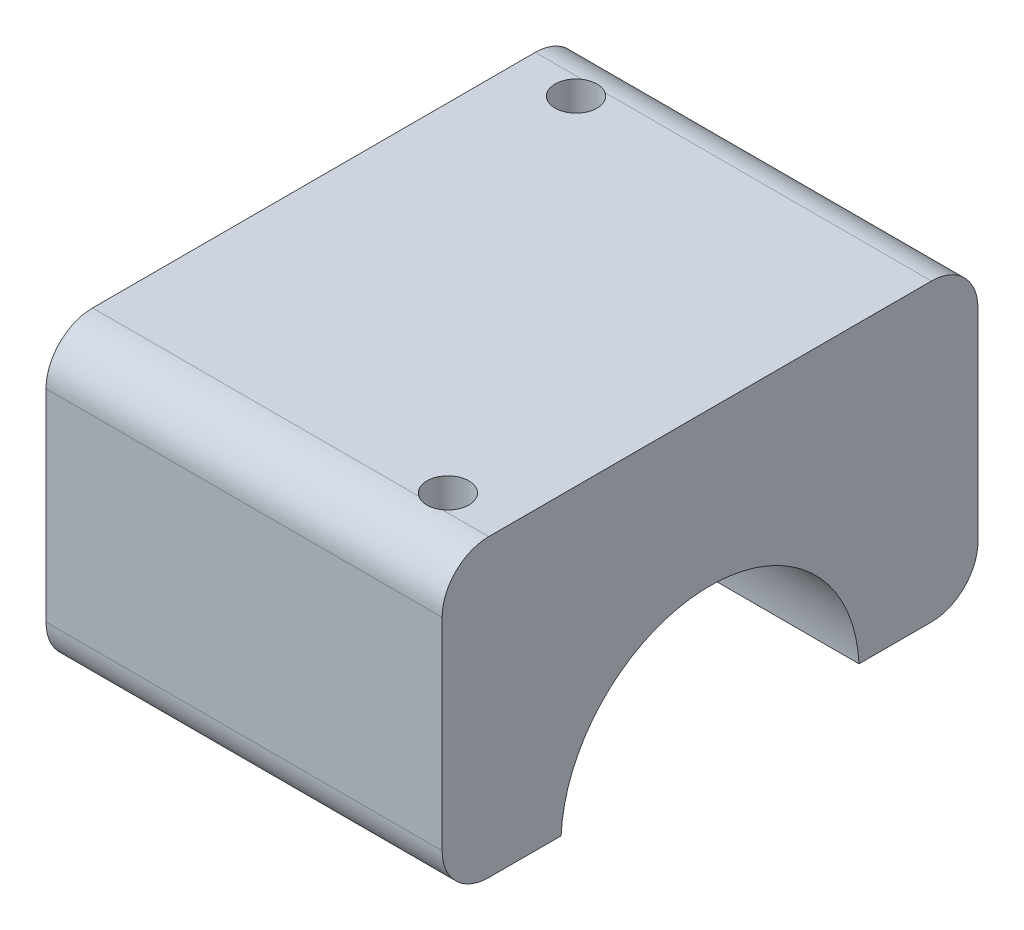
ISO-10303-21;
HEADER;
FILE_DESCRIPTION(('STEP AP214'),'2;1');
FILE_NAME('part.step','',(''),(''),'','','');
FILE_SCHEMA(('AUTOMOTIVE_DESIGN { 1 0 10303 214 1 1 1 1 }'));
ENDSEC;
DATA;
#1=APPLICATION_CONTEXT('core data for automotive mechanical design processes');
#2=APPLICATION_PROTOCOL_DEFINITION('international standard','automotive_design',2000,#1);
#3=PRODUCT_CONTEXT('',#1,'mechanical');
#4=PRODUCT('Part','Part','',(#3));
#5=PRODUCT_RELATED_PRODUCT_CATEGORY('part','',(#4));
#6=PRODUCT_DEFINITION_FORMATION('','',#4);
#7=PRODUCT_DEFINITION_CONTEXT('part definition',#1,'design');
#8=PRODUCT_DEFINITION('design','',#6,#7);
#9=PRODUCT_DEFINITION_SHAPE('','',#8);
#10=(LENGTH_UNIT() NAMED_UNIT(*) SI_UNIT(.MILLI.,.METRE.));
#11=(NAMED_UNIT(*) PLANE_ANGLE_UNIT() SI_UNIT($,.RADIAN.));
#12=(NAMED_UNIT(*) SI_UNIT($,.STERADIAN.) SOLID_ANGLE_UNIT());
#13=UNCERTAINTY_MEASURE_WITH_UNIT(LENGTH_MEASURE(1.E-05),#10,'distance_accuracy_value','');
#14=(GEOMETRIC_REPRESENTATION_CONTEXT(3) GLOBAL_UNCERTAINTY_ASSIGNED_CONTEXT((#13)) GLOBAL_UNIT_ASSIGNED_CONTEXT((#10,
#11,#12)) REPRESENTATION_CONTEXT('',''));
#15=CARTESIAN_POINT('',(0.,0.,0.));
#16=DIRECTION('',(0.,0.,1.));
#17=DIRECTION('',(1.,0.,0.));
#18=AXIS2_PLACEMENT_3D('',#15,#16,#17);
#19=CARTESIAN_POINT('',(17.,4.6,19.));
#20=DIRECTION('',(-1.,0.,0.));
#21=DIRECTION('',(0.,0.,1.));
#22=AXIS2_PLACEMENT_3D('',#19,#20,#21);
#23=CYLINDRICAL_SURFACE('',#22,4.);
#24=CARTESIAN_POINT('',(12.9949874371066,0.6,19.));
#25=CARTESIAN_POINT('',(12.9528080505859,0.600002290201008,19.0279782687762));
#26=CARTESIAN_POINT('',(12.9094699375662,0.600293109258532,19.054162436945));
#27=CARTESIAN_POINT('',(12.8207506643026,0.601246630542694,19.1027880961604));
#28=CARTESIAN_POINT('',(12.775369663094,0.601909303866988,19.1252298779078));
#29=CARTESIAN_POINT('',(12.6367080465194,0.60414515604213,19.1866521635867));
#30=CARTESIAN_POINT('',(12.5407755741953,0.605967454515857,19.2198177956695));
#31=CARTESIAN_POINT('',(12.3447108790185,0.609016111648687,19.2695824039112));
#32=CARTESIAN_POINT('',(12.2445771529861,0.610242254997947,19.2861753969049));
#33=CARTESIAN_POINT('',(12.0429252939834,0.611432977587128,19.3023260095373));
#34=CARTESIAN_POINT('',(11.9414072407699,0.611397629202322,19.3018846064864));
#35=CARTESIAN_POINT('',(11.7400149572337,0.6100843959537,19.2839916011113));
#36=CARTESIAN_POINT('',(11.6401391343925,0.608807797075412,19.266557603754));
#37=CARTESIAN_POINT('',(11.444762981889,0.605710678825216,19.2151942389305));
#38=CARTESIAN_POINT('',(11.3492591599958,0.603890602630139,19.181278297527));
#39=CARTESIAN_POINT('',(11.2134628948282,0.601745422922836,19.1197807652606));
#40=CARTESIAN_POINT('',(11.1703945654969,0.601136078493984,19.0981480345368));
#41=CARTESIAN_POINT('',(11.0862091669758,0.600264553601652,19.0515455180329));
#42=CARTESIAN_POINT('',(11.0450884560688,0.600001698383489,19.0265823227808));
#43=CARTESIAN_POINT('',(11.0050125628934,0.6,19.));
#44=B_SPLINE_CURVE_WITH_KNOTS('',3,(#24,#25,#26,#27,#28,#29,#30,#31,#32,#33,#34,#35,#36,#37,#38,
#39,#40,#41,#42,#43),.UNSPECIFIED.,.F.,.F.,(4,2,2,2,2,2,2,2,2,4),(0.,0.151748564164442,
0.30348533531734,0.606485618853393,0.90959525408197,1.21268749909945,1.51546606256915,
1.81799839737315,1.96246492195647,2.10664969408635),.UNSPECIFIED.);
#45=CARTESIAN_POINT('',(12.9949874371066,0.6,19.));
#46=VERTEX_POINT('',#45);
#47=CARTESIAN_POINT('',(11.0050125628934,0.6,19.));
#48=VERTEX_POINT('',#47);
#49=EDGE_CURVE('E136',#46,#48,#44,.T.);
#50=ORIENTED_EDGE('',*,*,#49,.F.);
#51=DIRECTION('',(-1.,0.,0.));
#52=VECTOR('',#51,1.);
#53=CARTESIAN_POINT('',(17.,0.6,19.));
#54=LINE('',#53,#52);
#55=CARTESIAN_POINT('',(17.,0.6,19.));
#56=VERTEX_POINT('',#55);
#57=EDGE_CURVE('E150',#56,#46,#54,.T.);
#58=ORIENTED_EDGE('',*,*,#57,.F.);
#59=CARTESIAN_POINT('',(17.,4.6,19.));
#60=DIRECTION('',(1.,0.,0.));
#61=DIRECTION('',(0.,0.,-1.));
#62=AXIS2_PLACEMENT_3D('',#59,#60,#61);
#63=CIRCLE('',#62,4.);
#64=CARTESIAN_POINT('',(17.,4.6,23.));
#65=VERTEX_POINT('',#64);
#66=EDGE_CURVE('E333',#65,#56,#63,.T.);
#67=ORIENTED_EDGE('',*,*,#66,.F.);
#68=DIRECTION('',(-1.,0.,0.));
#69=VECTOR('',#68,1.);
#70=CARTESIAN_POINT('',(17.,4.6,23.));
#71=LINE('',#70,#69);
#72=CARTESIAN_POINT('',(-17.,4.6,23.));
#73=VERTEX_POINT('',#72);
#74=EDGE_CURVE('E313',#65,#73,#71,.T.);
#75=ORIENTED_EDGE('',*,*,#74,.T.);
#76=CARTESIAN_POINT('',(-17.,4.6,19.));
#77=DIRECTION('',(1.,0.,0.));
#78=DIRECTION('',(0.,0.,-1.));
#79=AXIS2_PLACEMENT_3D('',#76,#77,#78);
#80=CIRCLE('',#79,4.);
#81=CARTESIAN_POINT('',(-17.,0.6,19.));
#82=VERTEX_POINT('',#81);
#83=EDGE_CURVE('E155',#73,#82,#80,.T.);
#84=ORIENTED_EDGE('',*,*,#83,.T.);
#85=EDGE_CURVE('E148',#48,#82,#54,.T.);
#86=ORIENTED_EDGE('',*,*,#85,.F.);
#87=EDGE_LOOP('',(#50,#58,#67,#75,#84,#86));
#88=FACE_BOUND('',#87,.T.);
#89=ADVANCED_FACE('F39',(#88),#23,.T.);
#90=CARTESIAN_POINT('',(17.,4.6,-19.));
#91=DIRECTION('',(-1.,0.,0.));
#92=DIRECTION('',(0.,0.,1.));
#93=AXIS2_PLACEMENT_3D('',#90,#91,#92);
#94=CYLINDRICAL_SURFACE('',#93,4.);
#95=CARTESIAN_POINT('',(-12.9949874371066,0.6,-19.));
#96=CARTESIAN_POINT('',(-12.9528080505859,0.600002290201008,-19.0279782687762));
#97=CARTESIAN_POINT('',(-12.9094699375662,0.600293109258532,-19.054162436945));
#98=CARTESIAN_POINT('',(-12.8207506643026,0.601246630542694,-19.1027880961604));
#99=CARTESIAN_POINT('',(-12.775369663094,0.601909303866988,-19.1252298779078));
#100=CARTESIAN_POINT('',(-12.6367080465194,0.60414515604213,-19.1866521635867));
#101=CARTESIAN_POINT('',(-12.5407755741953,0.605967454515857,-19.2198177956695));
#102=CARTESIAN_POINT('',(-12.3447108790185,0.609016111648687,-19.2695824039112));
#103=CARTESIAN_POINT('',(-12.2445771529861,0.610242254997947,-19.2861753969049));
#104=CARTESIAN_POINT('',(-12.0429252939834,0.611432977587128,-19.3023260095373));
#105=CARTESIAN_POINT('',(-11.9414072407699,0.611397629202322,-19.3018846064864));
#106=CARTESIAN_POINT('',(-11.7400149572337,0.6100843959537,-19.2839916011113));
#107=CARTESIAN_POINT('',(-11.6401391343925,0.608807797075412,-19.266557603754));
#108=CARTESIAN_POINT('',(-11.444762981889,0.605710678825216,-19.2151942389305));
#109=CARTESIAN_POINT('',(-11.3492591599958,0.603890602630139,-19.181278297527));
#110=CARTESIAN_POINT('',(-11.2134628948282,0.601745422922836,-19.1197807652606));
#111=CARTESIAN_POINT('',(-11.1703945654969,0.601136078493984,-19.0981480345368));
#112=CARTESIAN_POINT('',(-11.0862091669758,0.600264553601652,-19.0515455180329));
#113=CARTESIAN_POINT('',(-11.0450884560688,0.600001698383489,-19.0265823227808));
#114=CARTESIAN_POINT('',(-11.0050125628934,0.6,-19.));
#115=B_SPLINE_CURVE_WITH_KNOTS('',3,(#95,#96,#97,#98,#99,#100,#101,#102,#103,#104,#105,#106,
#107,#108,#109,#110,#111,#112,#113,#114),.UNSPECIFIED.,.F.,.F.,(4,2,2,2,2,2,2,2,2,4),(0.,
0.151748564164442,0.30348533531734,0.606485618853393,0.90959525408197,1.21268749909945,
1.51546606256915,1.81799839737315,1.96246492195647,2.10664969408635),.UNSPECIFIED.);
#116=CARTESIAN_POINT('',(-12.9949874371066,0.6,-19.));
#117=VERTEX_POINT('',#116);
#118=CARTESIAN_POINT('',(-11.0050125628934,0.6,-19.));
#119=VERTEX_POINT('',#118);
#120=EDGE_CURVE('E194',#117,#119,#115,.T.);
#121=ORIENTED_EDGE('',*,*,#120,.F.);
#122=DIRECTION('',(-1.,0.,0.));
#123=VECTOR('',#122,1.);
#124=CARTESIAN_POINT('',(17.,0.6,-19.));
#125=LINE('',#124,#123);
#126=CARTESIAN_POINT('',(-17.,0.6,-19.));
#127=VERTEX_POINT('',#126);
#128=EDGE_CURVE('E159',#117,#127,#125,.T.);
#129=ORIENTED_EDGE('',*,*,#128,.T.);
#130=CARTESIAN_POINT('',(-17.,4.6,-19.));
#131=DIRECTION('',(1.,0.,0.));
#132=DIRECTION('',(0.,0.,-1.));
#133=AXIS2_PLACEMENT_3D('',#130,#131,#132);
#134=CIRCLE('',#133,4.);
#135=CARTESIAN_POINT('',(-17.,4.6,-23.));
#136=VERTEX_POINT('',#135);
#137=EDGE_CURVE('E319',#127,#136,#134,.T.);
#138=ORIENTED_EDGE('',*,*,#137,.T.);
#139=DIRECTION('',(-1.,0.,0.));
#140=VECTOR('',#139,1.);
#141=CARTESIAN_POINT('',(17.,4.6,-23.));
#142=LINE('',#141,#140);
#143=CARTESIAN_POINT('',(17.,4.6,-23.));
#144=VERTEX_POINT('',#143);
#145=EDGE_CURVE('E293',#144,#136,#142,.T.);
#146=ORIENTED_EDGE('',*,*,#145,.F.);
#147=CARTESIAN_POINT('',(17.,4.6,-19.));
#148=DIRECTION('',(1.,0.,0.));
#149=DIRECTION('',(0.,0.,-1.));
#150=AXIS2_PLACEMENT_3D('',#147,#148,#149);
#151=CIRCLE('',#150,4.);
#152=CARTESIAN_POINT('',(17.,0.6,-19.));
#153=VERTEX_POINT('',#152);
#154=EDGE_CURVE('E291',#153,#144,#151,.T.);
#155=ORIENTED_EDGE('',*,*,#154,.F.);
#156=EDGE_CURVE('E156',#153,#119,#125,.T.);
#157=ORIENTED_EDGE('',*,*,#156,.T.);
#158=EDGE_LOOP('',(#121,#129,#138,#146,#155,#157));
#159=FACE_BOUND('',#158,.T.);
#160=ADVANCED_FACE('F205',(#159),#94,.T.);
#161=CARTESIAN_POINT('',(17.,21.951,-19.));
#162=DIRECTION('',(-1.,0.,0.));
#163=DIRECTION('',(0.,0.,1.));
#164=AXIS2_PLACEMENT_3D('',#161,#162,#163);
#165=CYLINDRICAL_SURFACE('',#164,4.);
#166=CARTESIAN_POINT('',(-11.0050125628934,25.951,-19.));
#167=CARTESIAN_POINT('',(-11.0471919494141,25.950997709799,-19.0279782687762));
#168=CARTESIAN_POINT('',(-11.0905300624338,25.9507068907415,-19.054162436945));
#169=CARTESIAN_POINT('',(-11.1792493356974,25.9497533694573,-19.1027880961604));
#170=CARTESIAN_POINT('',(-11.224630336906,25.949090696133,-19.1252298779078));
#171=CARTESIAN_POINT('',(-11.3632919534806,25.9468548439579,-19.1866521635867));
#172=CARTESIAN_POINT('',(-11.4592244258047,25.9450325454841,-19.2198177956695));
#173=CARTESIAN_POINT('',(-11.6552891209815,25.9419838883513,-19.2695824039112));
#174=CARTESIAN_POINT('',(-11.7554228470139,25.9407577450021,-19.2861753969049));
#175=CARTESIAN_POINT('',(-11.9570747060166,25.9395670224129,-19.3023260095373));
#176=CARTESIAN_POINT('',(-12.0585927592301,25.9396023707977,-19.3018846064864));
#177=CARTESIAN_POINT('',(-12.2599850427663,25.9409156040463,-19.2839916011113));
#178=CARTESIAN_POINT('',(-12.3598608656075,25.9421922029246,-19.266557603754));
#179=CARTESIAN_POINT('',(-12.555237018111,25.9452893211748,-19.2151942389305));
#180=CARTESIAN_POINT('',(-12.6507408400042,25.9471093973699,-19.181278297527));
#181=CARTESIAN_POINT('',(-12.7865371051718,25.9492545770772,-19.1197807652606));
#182=CARTESIAN_POINT('',(-12.8296054345031,25.949863921506,-19.0981480345368));
#183=CARTESIAN_POINT('',(-12.9137908330242,25.9507354463983,-19.0515455180329));
#184=CARTESIAN_POINT('',(-12.9549115439312,25.9509983016165,-19.0265823227808));
#185=CARTESIAN_POINT('',(-12.9949874371066,25.951,-19.));
#186=B_SPLINE_CURVE_WITH_KNOTS('',3,(#166,#167,#168,#169,#170,#171,#172,#173,#174,#175,#176,
#177,#178,#179,#180,#181,#182,#183,#184,#185),.UNSPECIFIED.,.F.,.F.,(4,2,2,2,2,2,2,2,2,4),(0.,
0.151748564164442,0.30348533531734,0.606485618853392,0.909595254081968,1.21268749909945,
1.51546606256915,1.81799839737315,1.96246492195647,2.10664969408635),.UNSPECIFIED.);
#187=CARTESIAN_POINT('',(-11.0050125628934,25.951,-19.));
#188=VERTEX_POINT('',#187);
#189=CARTESIAN_POINT('',(-12.9949874371066,25.951,-19.));
#190=VERTEX_POINT('',#189);
#191=EDGE_CURVE('E142',#188,#190,#186,.T.);
#192=ORIENTED_EDGE('',*,*,#191,.F.);
#193=DIRECTION('',(-1.,0.,0.));
#194=VECTOR('',#193,1.);
#195=CARTESIAN_POINT('',(17.,25.951,-19.));
#196=LINE('',#195,#194);
#197=CARTESIAN_POINT('',(17.,25.951,-19.));
#198=VERTEX_POINT('',#197);
#199=EDGE_CURVE('E343',#198,#188,#196,.T.);
#200=ORIENTED_EDGE('',*,*,#199,.F.);
#201=CARTESIAN_POINT('',(17.,21.951,-19.));
#202=DIRECTION('',(1.,0.,0.));
#203=DIRECTION('',(0.,0.,-1.));
#204=AXIS2_PLACEMENT_3D('',#201,#202,#203);
#205=CIRCLE('',#204,4.);
#206=CARTESIAN_POINT('',(17.,21.951,-23.));
#207=VERTEX_POINT('',#206);
#208=EDGE_CURVE('E299',#207,#198,#205,.T.);
#209=ORIENTED_EDGE('',*,*,#208,.F.);
#210=DIRECTION('',(-1.,0.,0.));
#211=VECTOR('',#210,1.);
#212=CARTESIAN_POINT('',(17.,21.951,-23.));
#213=LINE('',#212,#211);
#214=CARTESIAN_POINT('',(-17.,21.951,-23.));
#215=VERTEX_POINT('',#214);
#216=EDGE_CURVE('E346',#207,#215,#213,.T.);
#217=ORIENTED_EDGE('',*,*,#216,.T.);
#218=CARTESIAN_POINT('',(-17.,21.951,-19.));
#219=DIRECTION('',(1.,0.,0.));
#220=DIRECTION('',(0.,0.,-1.));
#221=AXIS2_PLACEMENT_3D('',#218,#219,#220);
#222=CIRCLE('',#221,4.);
#223=CARTESIAN_POINT('',(-17.,25.951,-19.));
#224=VERTEX_POINT('',#223);
#225=EDGE_CURVE('E323',#215,#224,#222,.T.);
#226=ORIENTED_EDGE('',*,*,#225,.T.);
#227=EDGE_CURVE('E342',#190,#224,#196,.T.);
#228=ORIENTED_EDGE('',*,*,#227,.F.);
#229=EDGE_LOOP('',(#192,#200,#209,#217,#226,#228));
#230=FACE_BOUND('',#229,.T.);
#231=ADVANCED_FACE('F201',(#230),#165,.T.);
#232=CARTESIAN_POINT('',(17.,21.951,19.));
#233=DIRECTION('',(-1.,0.,0.));
#234=DIRECTION('',(0.,0.,1.));
#235=AXIS2_PLACEMENT_3D('',#232,#233,#234);
#236=CYLINDRICAL_SURFACE('',#235,4.);
#237=CARTESIAN_POINT('',(11.0050125628934,25.951,19.));
#238=CARTESIAN_POINT('',(11.0471919494141,25.950997709799,19.0279782687762));
#239=CARTESIAN_POINT('',(11.0905300624338,25.9507068907415,19.054162436945));
#240=CARTESIAN_POINT('',(11.1792493356974,25.9497533694573,19.1027880961604));
#241=CARTESIAN_POINT('',(11.224630336906,25.949090696133,19.1252298779078));
#242=CARTESIAN_POINT('',(11.3632919534806,25.9468548439579,19.1866521635867));
#243=CARTESIAN_POINT('',(11.4592244258047,25.9450325454841,19.2198177956695));
#244=CARTESIAN_POINT('',(11.6552891209815,25.9419838883513,19.2695824039112));
#245=CARTESIAN_POINT('',(11.7554228470139,25.9407577450021,19.2861753969049));
#246=CARTESIAN_POINT('',(11.9570747060166,25.9395670224129,19.3023260095373));
#247=CARTESIAN_POINT('',(12.0585927592301,25.9396023707977,19.3018846064864));
#248=CARTESIAN_POINT('',(12.2599850427663,25.9409156040463,19.2839916011113));
#249=CARTESIAN_POINT('',(12.3598608656075,25.9421922029246,19.266557603754));
#250=CARTESIAN_POINT('',(12.555237018111,25.9452893211748,19.2151942389305));
#251=CARTESIAN_POINT('',(12.6507408400042,25.9471093973699,19.181278297527));
#252=CARTESIAN_POINT('',(12.7865371051718,25.9492545770772,19.1197807652606));
#253=CARTESIAN_POINT('',(12.8296054345031,25.949863921506,19.0981480345368));
#254=CARTESIAN_POINT('',(12.9137908330242,25.9507354463983,19.0515455180329));
#255=CARTESIAN_POINT('',(12.9549115439312,25.9509983016165,19.0265823227808));
#256=CARTESIAN_POINT('',(12.9949874371066,25.951,19.));
#257=B_SPLINE_CURVE_WITH_KNOTS('',3,(#237,#238,#239,#240,#241,#242,#243,#244,#245,#246,#247,
#248,#249,#250,#251,#252,#253,#254,#255,#256),.UNSPECIFIED.,.F.,.F.,(4,2,2,2,2,2,2,2,2,4),(0.,
0.151748564164442,0.30348533531734,0.606485618853392,0.909595254081968,1.21268749909945,
1.51546606256915,1.81799839737315,1.96246492195647,2.10664969408635),.UNSPECIFIED.);
#258=CARTESIAN_POINT('',(11.0050125628934,25.951,19.));
#259=VERTEX_POINT('',#258);
#260=CARTESIAN_POINT('',(12.9949874371066,25.951,19.));
#261=VERTEX_POINT('',#260);
#262=EDGE_CURVE('E47',#259,#261,#257,.T.);
#263=ORIENTED_EDGE('',*,*,#262,.F.);
#264=DIRECTION('',(-1.,0.,0.));
#265=VECTOR('',#264,1.);
#266=CARTESIAN_POINT('',(17.,25.951,19.));
#267=LINE('',#266,#265);
#268=CARTESIAN_POINT('',(-17.,25.951,19.));
#269=VERTEX_POINT('',#268);
#270=EDGE_CURVE('E338',#259,#269,#267,.T.);
#271=ORIENTED_EDGE('',*,*,#270,.T.);
#272=CARTESIAN_POINT('',(-17.,21.951,19.));
#273=DIRECTION('',(1.,0.,0.));
#274=DIRECTION('',(0.,0.,-1.));
#275=AXIS2_PLACEMENT_3D('',#272,#273,#274);
#276=CIRCLE('',#275,4.);
#277=CARTESIAN_POINT('',(-17.,21.951,23.));
#278=VERTEX_POINT('',#277);
#279=EDGE_CURVE('E329',#269,#278,#276,.T.);
#280=ORIENTED_EDGE('',*,*,#279,.T.);
#281=DIRECTION('',(-1.,0.,0.));
#282=VECTOR('',#281,1.);
#283=CARTESIAN_POINT('',(17.,21.951,23.));
#284=LINE('',#283,#282);
#285=CARTESIAN_POINT('',(17.,21.951,23.));
#286=VERTEX_POINT('',#285);
#287=EDGE_CURVE('E335',#286,#278,#284,.T.);
#288=ORIENTED_EDGE('',*,*,#287,.F.);
#289=CARTESIAN_POINT('',(17.,21.951,19.));
#290=DIRECTION('',(1.,0.,0.));
#291=DIRECTION('',(0.,0.,-1.));
#292=AXIS2_PLACEMENT_3D('',#289,#290,#291);
#293=CIRCLE('',#292,4.);
#294=CARTESIAN_POINT('',(17.,25.951,19.));
#295=VERTEX_POINT('',#294);
#296=EDGE_CURVE('E309',#295,#286,#293,.T.);
#297=ORIENTED_EDGE('',*,*,#296,.F.);
#298=EDGE_CURVE('E339',#295,#261,#267,.T.);
#299=ORIENTED_EDGE('',*,*,#298,.T.);
#300=EDGE_LOOP('',(#263,#271,#280,#288,#297,#299));
#301=FACE_BOUND('',#300,.T.);
#302=ADVANCED_FACE('F168',(#301),#236,.T.);
#303=CARTESIAN_POINT('',(17.,0.6,19.));
#304=DIRECTION('',(0.,1.,0.));
#305=DIRECTION('',(0.,0.,1.));
#306=AXIS2_PLACEMENT_3D('',#303,#304,#305);
#307=PLANE('',#306);
#308=CARTESIAN_POINT('',(12.,0.6,17.5));
#309=DIRECTION('',(0.,1.,0.));
#310=DIRECTION('',(0.,0.,1.));
#311=AXIS2_PLACEMENT_3D('',#308,#309,#310);
#312=CIRCLE('',#311,1.8);
#313=EDGE_CURVE('E53',#46,#48,#312,.T.);
#314=ORIENTED_EDGE('',*,*,#313,.T.);
#315=ORIENTED_EDGE('',*,*,#85,.T.);
#316=DIRECTION('',(0.,0.,-1.));
#317=VECTOR('',#316,1.);
#318=CARTESIAN_POINT('',(-17.,0.6,19.));
#319=LINE('',#318,#317);
#320=CARTESIAN_POINT('',(-17.,0.6,12.7859297667397));
#321=VERTEX_POINT('',#320);
#322=EDGE_CURVE('E317',#82,#321,#319,.T.);
#323=ORIENTED_EDGE('',*,*,#322,.T.);
#324=DIRECTION('',(1.,0.,0.));
#325=VECTOR('',#324,1.);
#326=CARTESIAN_POINT('',(-17.,0.6,12.7859297667397));
#327=LINE('',#326,#325);
#328=CARTESIAN_POINT('',(17.,0.6,12.7859297667397));
#329=VERTEX_POINT('',#328);
#330=EDGE_CURVE('E316',#321,#329,#327,.T.);
#331=ORIENTED_EDGE('',*,*,#330,.T.);
#332=DIRECTION('',(0.,0.,-1.));
#333=VECTOR('',#332,1.);
#334=CARTESIAN_POINT('',(17.,0.6,19.));
#335=LINE('',#334,#333);
#336=EDGE_CURVE('E297',#56,#329,#335,.T.);
#337=ORIENTED_EDGE('',*,*,#336,.F.);
#338=ORIENTED_EDGE('',*,*,#57,.T.);
#339=EDGE_LOOP('',(#314,#315,#323,#331,#337,#338));
#340=FACE_BOUND('',#339,.T.);
#341=ADVANCED_FACE('F146',(#340),#307,.F.);
#342=CARTESIAN_POINT('',(-12.,0.6,-17.5));
#343=DIRECTION('',(0.,1.,0.));
#344=DIRECTION('',(0.,0.,1.));
#345=AXIS2_PLACEMENT_3D('',#342,#343,#344);
#346=CIRCLE('',#345,1.8);
#347=EDGE_CURVE('E60',#117,#119,#346,.T.);
#348=ORIENTED_EDGE('',*,*,#347,.T.);
#349=ORIENTED_EDGE('',*,*,#156,.F.);
#350=CARTESIAN_POINT('',(17.,0.6,-12.7859297667397));
#351=VERTEX_POINT('',#350);
#352=EDGE_CURVE('E302',#351,#153,#335,.T.);
#353=ORIENTED_EDGE('',*,*,#352,.F.);
#354=DIRECTION('',(1.,0.,0.));
#355=VECTOR('',#354,1.);
#356=CARTESIAN_POINT('',(-17.,0.6,-12.7859297667397));
#357=LINE('',#356,#355);
#358=CARTESIAN_POINT('',(-17.,0.6,-12.7859297667397));
#359=VERTEX_POINT('',#358);
#360=EDGE_CURVE('E352',#351,#359,#357,.F.);
#361=ORIENTED_EDGE('',*,*,#360,.T.);
#362=EDGE_CURVE('E315',#359,#127,#319,.T.);
#363=ORIENTED_EDGE('',*,*,#362,.T.);
#364=ORIENTED_EDGE('',*,*,#128,.F.);
#365=EDGE_LOOP('',(#348,#349,#353,#361,#363,#364));
#366=FACE_BOUND('',#365,.T.);
#367=ADVANCED_FACE('F210',(#366),#307,.F.);
#368=CARTESIAN_POINT('',(17.,4.6,-23.));
#369=DIRECTION('',(0.,0.,1.));
#370=DIRECTION('',(1.,0.,0.));
#371=AXIS2_PLACEMENT_3D('',#368,#369,#370);
#372=PLANE('',#371);
#373=DIRECTION('',(0.,1.,0.));
#374=VECTOR('',#373,1.);
#375=CARTESIAN_POINT('',(-17.,4.6,-23.));
#376=LINE('',#375,#374);
#377=EDGE_CURVE('E321',#136,#215,#376,.T.);
#378=ORIENTED_EDGE('',*,*,#377,.T.);
#379=ORIENTED_EDGE('',*,*,#216,.F.);
#380=DIRECTION('',(0.,1.,0.));
#381=VECTOR('',#380,1.);
#382=CARTESIAN_POINT('',(17.,4.6,-23.));
#383=LINE('',#382,#381);
#384=EDGE_CURVE('E296',#144,#207,#383,.T.);
#385=ORIENTED_EDGE('',*,*,#384,.F.);
#386=ORIENTED_EDGE('',*,*,#145,.T.);
#387=EDGE_LOOP('',(#378,#379,#385,#386));
#388=FACE_BOUND('',#387,.T.);
#389=ADVANCED_FACE('F208',(#388),#372,.F.);
#390=CARTESIAN_POINT('',(17.,25.951,-19.));
#391=DIRECTION('',(0.,-1.,0.));
#392=DIRECTION('',(0.,0.,-1.));
#393=AXIS2_PLACEMENT_3D('',#390,#391,#392);
#394=PLANE('',#393);
#395=CARTESIAN_POINT('',(12.,25.951,17.5));
#396=DIRECTION('',(0.,-1.,0.));
#397=DIRECTION('',(0.,0.,-1.));
#398=AXIS2_PLACEMENT_3D('',#395,#396,#397);
#399=CIRCLE('',#398,1.8);
#400=EDGE_CURVE('E143',#261,#259,#399,.F.);
#401=ORIENTED_EDGE('',*,*,#400,.F.);
#402=ORIENTED_EDGE('',*,*,#298,.F.);
#403=DIRECTION('',(0.,0.,1.));
#404=VECTOR('',#403,1.);
#405=CARTESIAN_POINT('',(17.,25.951,-19.));
#406=LINE('',#405,#404);
#407=EDGE_CURVE('E307',#198,#295,#406,.T.);
#408=ORIENTED_EDGE('',*,*,#407,.F.);
#409=ORIENTED_EDGE('',*,*,#199,.T.);
#410=CARTESIAN_POINT('',(-12.,25.951,-17.5));
#411=DIRECTION('',(0.,-1.,0.));
#412=DIRECTION('',(0.,0.,-1.));
#413=AXIS2_PLACEMENT_3D('',#410,#411,#412);
#414=CIRCLE('',#413,1.8);
#415=EDGE_CURVE('E11',#190,#188,#414,.F.);
#416=ORIENTED_EDGE('',*,*,#415,.F.);
#417=ORIENTED_EDGE('',*,*,#227,.T.);
#418=DIRECTION('',(0.,0.,1.));
#419=VECTOR('',#418,1.);
#420=CARTESIAN_POINT('',(-17.,25.951,-19.));
#421=LINE('',#420,#419);
#422=EDGE_CURVE('E326',#224,#269,#421,.T.);
#423=ORIENTED_EDGE('',*,*,#422,.T.);
#424=ORIENTED_EDGE('',*,*,#270,.F.);
#425=EDGE_LOOP('',(#401,#402,#408,#409,#416,#417,#423,#424));
#426=FACE_BOUND('',#425,.T.);
#427=ADVANCED_FACE('F207',(#426),#394,.F.);
#428=CARTESIAN_POINT('',(17.,21.951,23.));
#429=DIRECTION('',(0.,0.,-1.));
#430=DIRECTION('',(-1.,0.,0.));
#431=AXIS2_PLACEMENT_3D('',#428,#429,#430);
#432=PLANE('',#431);
#433=DIRECTION('',(0.,-1.,0.));
#434=VECTOR('',#433,1.);
#435=CARTESIAN_POINT('',(-17.,21.951,23.));
#436=LINE('',#435,#434);
#437=EDGE_CURVE('E331',#278,#73,#436,.T.);
#438=ORIENTED_EDGE('',*,*,#437,.T.);
#439=ORIENTED_EDGE('',*,*,#74,.F.);
#440=DIRECTION('',(0.,-1.,0.));
#441=VECTOR('',#440,1.);
#442=CARTESIAN_POINT('',(17.,21.951,23.));
#443=LINE('',#442,#441);
#444=EDGE_CURVE('E311',#286,#65,#443,.T.);
#445=ORIENTED_EDGE('',*,*,#444,.F.);
#446=ORIENTED_EDGE('',*,*,#287,.T.);
#447=EDGE_LOOP('',(#438,#439,#445,#446));
#448=FACE_BOUND('',#447,.T.);
#449=ADVANCED_FACE('F376',(#448),#432,.F.);
#450=CARTESIAN_POINT('',(17.,4.6,19.));
#451=DIRECTION('',(1.,0.,0.));
#452=DIRECTION('',(0.,0.,-1.));
#453=AXIS2_PLACEMENT_3D('',#450,#451,#452);
#454=PLANE('',#453);
#455=CARTESIAN_POINT('',(17.,0.,0.));
#456=DIRECTION('',(1.,0.,0.));
#457=DIRECTION('',(0.,0.,-1.));
#458=AXIS2_PLACEMENT_3D('',#455,#456,#457);
#459=CIRCLE('',#458,12.8);
#460=EDGE_CURVE('E285',#351,#329,#459,.T.);
#461=ORIENTED_EDGE('',*,*,#460,.F.);
#462=ORIENTED_EDGE('',*,*,#352,.T.);
#463=ORIENTED_EDGE('',*,*,#154,.T.);
#464=ORIENTED_EDGE('',*,*,#384,.T.);
#465=ORIENTED_EDGE('',*,*,#208,.T.);
#466=ORIENTED_EDGE('',*,*,#407,.T.);
#467=ORIENTED_EDGE('',*,*,#296,.T.);
#468=ORIENTED_EDGE('',*,*,#444,.T.);
#469=ORIENTED_EDGE('',*,*,#66,.T.);
#470=ORIENTED_EDGE('',*,*,#336,.T.);
#471=EDGE_LOOP('',(#461,#462,#463,#464,#465,#466,#467,#468,#469,#470));
#472=FACE_BOUND('',#471,.T.);
#473=ADVANCED_FACE('F363',(#472),#454,.T.);
#474=CARTESIAN_POINT('',(-17.,4.6,19.));
#475=DIRECTION('',(1.,0.,0.));
#476=DIRECTION('',(0.,0.,-1.));
#477=AXIS2_PLACEMENT_3D('',#474,#475,#476);
#478=PLANE('',#477);
#479=ORIENTED_EDGE('',*,*,#362,.F.);
#480=CARTESIAN_POINT('',(-17.,0.,0.));
#481=DIRECTION('',(1.,0.,0.));
#482=DIRECTION('',(0.,0.,-1.));
#483=AXIS2_PLACEMENT_3D('',#480,#481,#482);
#484=CIRCLE('',#483,12.8);
#485=EDGE_CURVE('E383',#359,#321,#484,.T.);
#486=ORIENTED_EDGE('',*,*,#485,.T.);
#487=ORIENTED_EDGE('',*,*,#322,.F.);
#488=ORIENTED_EDGE('',*,*,#83,.F.);
#489=ORIENTED_EDGE('',*,*,#437,.F.);
#490=ORIENTED_EDGE('',*,*,#279,.F.);
#491=ORIENTED_EDGE('',*,*,#422,.F.);
#492=ORIENTED_EDGE('',*,*,#225,.F.);
#493=ORIENTED_EDGE('',*,*,#377,.F.);
#494=ORIENTED_EDGE('',*,*,#137,.F.);
#495=EDGE_LOOP('',(#479,#486,#487,#488,#489,#490,#491,#492,#493,#494));
#496=FACE_BOUND('',#495,.T.);
#497=ADVANCED_FACE('F254',(#496),#478,.F.);
#498=CARTESIAN_POINT('',(-17.,0.,0.));
#499=DIRECTION('',(1.,0.,0.));
#500=DIRECTION('',(0.,0.,-1.));
#501=AXIS2_PLACEMENT_3D('',#498,#499,#500);
#502=CYLINDRICAL_SURFACE('',#501,12.8);
#503=ORIENTED_EDGE('',*,*,#485,.F.);
#504=ORIENTED_EDGE('',*,*,#360,.F.);
#505=ORIENTED_EDGE('',*,*,#460,.T.);
#506=ORIENTED_EDGE('',*,*,#330,.F.);
#507=EDGE_LOOP('',(#503,#504,#505,#506));
#508=FACE_BOUND('',#507,.T.);
#509=ADVANCED_FACE('F176',(#508),#502,.F.);
#510=CARTESIAN_POINT('',(12.,26.551,17.5));
#511=DIRECTION('',(0.,-1.,0.));
#512=DIRECTION('',(0.,0.,-1.));
#513=AXIS2_PLACEMENT_3D('',#510,#511,#512);
#514=CYLINDRICAL_SURFACE('',#513,1.8);
#515=ORIENTED_EDGE('',*,*,#400,.T.);
#516=ORIENTED_EDGE('',*,*,#262,.T.);
#517=EDGE_LOOP('',(#515,#516));
#518=FACE_BOUND('',#517,.T.);
#519=ORIENTED_EDGE('',*,*,#49,.T.);
#520=ORIENTED_EDGE('',*,*,#313,.F.);
#521=EDGE_LOOP('',(#519,#520));
#522=FACE_BOUND('',#521,.T.);
#523=ADVANCED_FACE('F137',(#518,#522),#514,.F.);
#524=CARTESIAN_POINT('',(-12.,26.551,-17.5));
#525=DIRECTION('',(0.,-1.,0.));
#526=DIRECTION('',(0.,0.,-1.));
#527=AXIS2_PLACEMENT_3D('',#524,#525,#526);
#528=CYLINDRICAL_SURFACE('',#527,1.8);
#529=ORIENTED_EDGE('',*,*,#191,.T.);
#530=ORIENTED_EDGE('',*,*,#415,.T.);
#531=EDGE_LOOP('',(#529,#530));
#532=FACE_BOUND('',#531,.T.);
#533=ORIENTED_EDGE('',*,*,#120,.T.);
#534=ORIENTED_EDGE('',*,*,#347,.F.);
#535=EDGE_LOOP('',(#533,#534));
#536=FACE_BOUND('',#535,.T.);
#537=ADVANCED_FACE('F175',(#532,#536),#528,.F.);
#538=CLOSED_SHELL('',(#89,#160,#231,#302,#341,#367,#389,#427,#449,#473,#497,#509,#523,#537));
#539=MANIFOLD_SOLID_BREP('B2',#538);
#540=ADVANCED_BREP_SHAPE_REPRESENTATION('',(#18,#539),#14);
#541=SHAPE_DEFINITION_REPRESENTATION(#9,#540);
ENDSEC;
END-ISO-10303-21;
